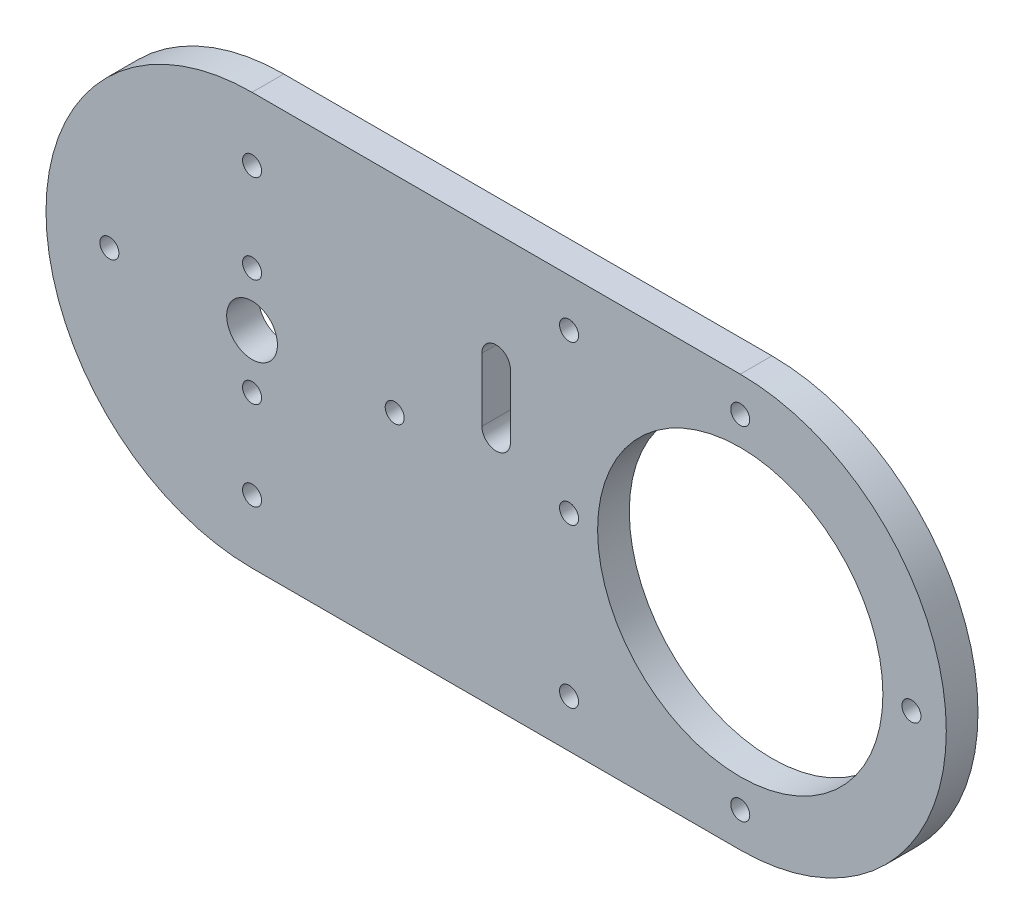
ISO-10303-21;
HEADER;
FILE_DESCRIPTION(('STEP AP214'),'2;1');
FILE_NAME('part.step','',(''),(''),'','','');
FILE_SCHEMA(('AUTOMOTIVE_DESIGN { 1 0 10303 214 1 1 1 1 }'));
ENDSEC;
DATA;
#1=APPLICATION_CONTEXT('core data for automotive mechanical design processes');
#2=APPLICATION_PROTOCOL_DEFINITION('international standard','automotive_design',2000,#1);
#3=PRODUCT_CONTEXT('',#1,'mechanical');
#4=PRODUCT('Part','Part','',(#3));
#5=PRODUCT_RELATED_PRODUCT_CATEGORY('part','',(#4));
#6=PRODUCT_DEFINITION_FORMATION('','',#4);
#7=PRODUCT_DEFINITION_CONTEXT('part definition',#1,'design');
#8=PRODUCT_DEFINITION('design','',#6,#7);
#9=PRODUCT_DEFINITION_SHAPE('','',#8);
#10=(LENGTH_UNIT() NAMED_UNIT(*) SI_UNIT(.MILLI.,.METRE.));
#11=(NAMED_UNIT(*) PLANE_ANGLE_UNIT() SI_UNIT($,.RADIAN.));
#12=(NAMED_UNIT(*) SI_UNIT($,.STERADIAN.) SOLID_ANGLE_UNIT());
#13=UNCERTAINTY_MEASURE_WITH_UNIT(LENGTH_MEASURE(1.E-05),#10,'distance_accuracy_value','');
#14=(GEOMETRIC_REPRESENTATION_CONTEXT(3) GLOBAL_UNCERTAINTY_ASSIGNED_CONTEXT((#13)) GLOBAL_UNIT_ASSIGNED_CONTEXT((#10,
#11,#12)) REPRESENTATION_CONTEXT('',''));
#15=CARTESIAN_POINT('',(0.,0.,0.));
#16=DIRECTION('',(0.,0.,1.));
#17=DIRECTION('',(1.,0.,0.));
#18=AXIS2_PLACEMENT_3D('',#15,#16,#17);
#19=CARTESIAN_POINT('',(-38.5,0.,5.));
#20=DIRECTION('',(0.,0.,1.));
#21=DIRECTION('',(1.,0.,0.));
#22=AXIS2_PLACEMENT_3D('',#19,#20,#21);
#23=PLANE('',#22);
#24=DIRECTION('',(0.,1.,0.));
#25=VECTOR('',#24,1.);
#26=CARTESIAN_POINT('',(2.25,5.,5.));
#27=LINE('',#26,#25);
#28=CARTESIAN_POINT('',(2.25,5.,5.));
#29=VERTEX_POINT('',#28);
#30=CARTESIAN_POINT('',(2.25,15.,5.));
#31=VERTEX_POINT('',#30);
#32=EDGE_CURVE('E105',#29,#31,#27,.T.);
#33=ORIENTED_EDGE('',*,*,#32,.F.);
#34=CARTESIAN_POINT('',(0.,5.,5.));
#35=DIRECTION('',(0.,0.,1.));
#36=DIRECTION('',(1.,0.,0.));
#37=AXIS2_PLACEMENT_3D('',#34,#35,#36);
#38=CIRCLE('',#37,2.25);
#39=CARTESIAN_POINT('',(-2.25,5.,5.));
#40=VERTEX_POINT('',#39);
#41=EDGE_CURVE('E97',#40,#29,#38,.T.);
#42=ORIENTED_EDGE('',*,*,#41,.F.);
#43=DIRECTION('',(0.,-1.,0.));
#44=VECTOR('',#43,1.);
#45=CARTESIAN_POINT('',(-2.25,5.,5.));
#46=LINE('',#45,#44);
#47=CARTESIAN_POINT('',(-2.25,15.,5.));
#48=VERTEX_POINT('',#47);
#49=EDGE_CURVE('E120',#48,#40,#46,.T.);
#50=ORIENTED_EDGE('',*,*,#49,.F.);
#51=CARTESIAN_POINT('',(0.,15.,5.));
#52=DIRECTION('',(0.,0.,1.));
#53=DIRECTION('',(1.,0.,0.));
#54=AXIS2_PLACEMENT_3D('',#51,#52,#53);
#55=CIRCLE('',#54,2.25);
#56=EDGE_CURVE('E118',#31,#48,#55,.T.);
#57=ORIENTED_EDGE('',*,*,#56,.F.);
#58=EDGE_LOOP('',(#33,#42,#50,#57));
#59=FACE_BOUND('',#58,.T.);
#60=CARTESIAN_POINT('',(11.5,25.,5.));
#61=DIRECTION('',(0.,0.,1.));
#62=DIRECTION('',(1.,0.,0.));
#63=AXIS2_PLACEMENT_3D('',#60,#61,#62);
#64=CIRCLE('',#63,1.5);
#65=CARTESIAN_POINT('',(13.,25.,5.));
#66=VERTEX_POINT('',#65);
#67=EDGE_CURVE('E136',#66,#66,#64,.T.);
#68=ORIENTED_EDGE('',*,*,#67,.F.);
#69=EDGE_LOOP('',(#68));
#70=FACE_BOUND('',#69,.T.);
#71=CARTESIAN_POINT('',(11.5,0.,5.));
#72=DIRECTION('',(0.,0.,1.));
#73=DIRECTION('',(1.,0.,0.));
#74=AXIS2_PLACEMENT_3D('',#71,#72,#73);
#75=CIRCLE('',#74,1.5);
#76=CARTESIAN_POINT('',(13.,0.,5.));
#77=VERTEX_POINT('',#76);
#78=EDGE_CURVE('E148',#77,#77,#75,.T.);
#79=ORIENTED_EDGE('',*,*,#78,.F.);
#80=EDGE_LOOP('',(#79));
#81=FACE_BOUND('',#80,.T.);
#82=CARTESIAN_POINT('',(-38.5,-22.5,5.));
#83=DIRECTION('',(0.,0.,1.));
#84=DIRECTION('',(1.,0.,0.));
#85=AXIS2_PLACEMENT_3D('',#82,#83,#84);
#86=CIRCLE('',#85,1.5);
#87=CARTESIAN_POINT('',(-37.,-22.5,5.));
#88=VERTEX_POINT('',#87);
#89=EDGE_CURVE('E160',#88,#88,#86,.T.);
#90=ORIENTED_EDGE('',*,*,#89,.F.);
#91=EDGE_LOOP('',(#90));
#92=FACE_BOUND('',#91,.T.);
#93=CARTESIAN_POINT('',(-38.5,22.5,5.));
#94=DIRECTION('',(0.,0.,1.));
#95=DIRECTION('',(1.,0.,0.));
#96=AXIS2_PLACEMENT_3D('',#93,#94,#95);
#97=CIRCLE('',#96,1.5);
#98=CARTESIAN_POINT('',(-37.,22.5,5.));
#99=VERTEX_POINT('',#98);
#100=EDGE_CURVE('E172',#99,#99,#97,.T.);
#101=ORIENTED_EDGE('',*,*,#100,.F.);
#102=EDGE_LOOP('',(#101));
#103=FACE_BOUND('',#102,.T.);
#104=CARTESIAN_POINT('',(-38.5,-8.5,5.));
#105=DIRECTION('',(0.,0.,1.));
#106=DIRECTION('',(1.,0.,0.));
#107=AXIS2_PLACEMENT_3D('',#104,#105,#106);
#108=CIRCLE('',#107,1.5);
#109=CARTESIAN_POINT('',(-37.,-8.5,5.));
#110=VERTEX_POINT('',#109);
#111=EDGE_CURVE('E184',#110,#110,#108,.T.);
#112=ORIENTED_EDGE('',*,*,#111,.F.);
#113=EDGE_LOOP('',(#112));
#114=FACE_BOUND('',#113,.T.);
#115=CARTESIAN_POINT('',(65.5,0.,5.));
#116=DIRECTION('',(0.,0.,1.));
#117=DIRECTION('',(1.,0.,0.));
#118=AXIS2_PLACEMENT_3D('',#115,#116,#117);
#119=CIRCLE('',#118,1.5);
#120=CARTESIAN_POINT('',(67.,0.,5.));
#121=VERTEX_POINT('',#120);
#122=EDGE_CURVE('E196',#121,#121,#119,.T.);
#123=ORIENTED_EDGE('',*,*,#122,.F.);
#124=EDGE_LOOP('',(#123));
#125=FACE_BOUND('',#124,.T.);
#126=CARTESIAN_POINT('',(-38.5,0.,5.));
#127=DIRECTION('',(0.,0.,1.));
#128=DIRECTION('',(1.,0.,0.));
#129=AXIS2_PLACEMENT_3D('',#126,#127,#128);
#130=CIRCLE('',#129,4.);
#131=CARTESIAN_POINT('',(-34.5,0.,5.));
#132=VERTEX_POINT('',#131);
#133=EDGE_CURVE('E208',#132,#132,#130,.T.);
#134=ORIENTED_EDGE('',*,*,#133,.F.);
#135=EDGE_LOOP('',(#134));
#136=FACE_BOUND('',#135,.T.);
#137=CARTESIAN_POINT('',(-38.5,0.,5.));
#138=DIRECTION('',(0.,0.,1.));
#139=DIRECTION('',(1.,0.,0.));
#140=AXIS2_PLACEMENT_3D('',#137,#138,#139);
#141=CIRCLE('',#140,32.5);
#142=CARTESIAN_POINT('',(-38.5,32.5,5.));
#143=VERTEX_POINT('',#142);
#144=CARTESIAN_POINT('',(-38.5,-32.5,5.));
#145=VERTEX_POINT('',#144);
#146=EDGE_CURVE('E214',#143,#145,#141,.T.);
#147=ORIENTED_EDGE('',*,*,#146,.T.);
#148=DIRECTION('',(1.,0.,0.));
#149=VECTOR('',#148,1.);
#150=CARTESIAN_POINT('',(-38.5,-32.5,5.));
#151=LINE('',#150,#149);
#152=CARTESIAN_POINT('',(38.5,-32.5,5.));
#153=VERTEX_POINT('',#152);
#154=EDGE_CURVE('E217',#145,#153,#151,.T.);
#155=ORIENTED_EDGE('',*,*,#154,.T.);
#156=CARTESIAN_POINT('',(38.5,0.,5.));
#157=DIRECTION('',(0.,0.,1.));
#158=DIRECTION('',(1.,0.,0.));
#159=AXIS2_PLACEMENT_3D('',#156,#157,#158);
#160=CIRCLE('',#159,32.5);
#161=CARTESIAN_POINT('',(38.5,32.5,5.));
#162=VERTEX_POINT('',#161);
#163=EDGE_CURVE('E220',#153,#162,#160,.T.);
#164=ORIENTED_EDGE('',*,*,#163,.T.);
#165=DIRECTION('',(-1.,0.,0.));
#166=VECTOR('',#165,1.);
#167=CARTESIAN_POINT('',(-38.5,32.5,5.));
#168=LINE('',#167,#166);
#169=EDGE_CURVE('E222',#162,#143,#168,.T.);
#170=ORIENTED_EDGE('',*,*,#169,.T.);
#171=EDGE_LOOP('',(#147,#155,#164,#170));
#172=FACE_BOUND('',#171,.T.);
#173=CARTESIAN_POINT('',(38.5,0.,5.));
#174=DIRECTION('',(0.,0.,1.));
#175=DIRECTION('',(1.,0.,0.));
#176=AXIS2_PLACEMENT_3D('',#173,#174,#175);
#177=CIRCLE('',#176,22.5);
#178=CARTESIAN_POINT('',(61.,0.,5.));
#179=VERTEX_POINT('',#178);
#180=EDGE_CURVE('E202',#179,#179,#177,.T.);
#181=ORIENTED_EDGE('',*,*,#180,.F.);
#182=EDGE_LOOP('',(#181));
#183=FACE_BOUND('',#182,.T.);
#184=CARTESIAN_POINT('',(-38.5,8.5,5.));
#185=DIRECTION('',(0.,0.,1.));
#186=DIRECTION('',(1.,0.,0.));
#187=AXIS2_PLACEMENT_3D('',#184,#185,#186);
#188=CIRCLE('',#187,1.5);
#189=CARTESIAN_POINT('',(-37.,8.5,5.));
#190=VERTEX_POINT('',#189);
#191=EDGE_CURVE('E190',#190,#190,#188,.T.);
#192=ORIENTED_EDGE('',*,*,#191,.F.);
#193=EDGE_LOOP('',(#192));
#194=FACE_BOUND('',#193,.T.);
#195=CARTESIAN_POINT('',(38.5,27.,5.));
#196=DIRECTION('',(0.,0.,1.));
#197=DIRECTION('',(1.,0.,0.));
#198=AXIS2_PLACEMENT_3D('',#195,#196,#197);
#199=CIRCLE('',#198,1.5);
#200=CARTESIAN_POINT('',(40.,27.,5.));
#201=VERTEX_POINT('',#200);
#202=EDGE_CURVE('E178',#201,#201,#199,.T.);
#203=ORIENTED_EDGE('',*,*,#202,.F.);
#204=EDGE_LOOP('',(#203));
#205=FACE_BOUND('',#204,.T.);
#206=CARTESIAN_POINT('',(-16.,0.,5.));
#207=DIRECTION('',(0.,0.,1.));
#208=DIRECTION('',(1.,0.,0.));
#209=AXIS2_PLACEMENT_3D('',#206,#207,#208);
#210=CIRCLE('',#209,1.5);
#211=CARTESIAN_POINT('',(-14.5,0.,5.));
#212=VERTEX_POINT('',#211);
#213=EDGE_CURVE('E166',#212,#212,#210,.T.);
#214=ORIENTED_EDGE('',*,*,#213,.F.);
#215=EDGE_LOOP('',(#214));
#216=FACE_BOUND('',#215,.T.);
#217=CARTESIAN_POINT('',(-61.,0.,5.));
#218=DIRECTION('',(0.,0.,1.));
#219=DIRECTION('',(1.,0.,0.));
#220=AXIS2_PLACEMENT_3D('',#217,#218,#219);
#221=CIRCLE('',#220,1.5);
#222=CARTESIAN_POINT('',(-59.5,0.,5.));
#223=VERTEX_POINT('',#222);
#224=EDGE_CURVE('E154',#223,#223,#221,.T.);
#225=ORIENTED_EDGE('',*,*,#224,.F.);
#226=EDGE_LOOP('',(#225));
#227=FACE_BOUND('',#226,.T.);
#228=CARTESIAN_POINT('',(11.5,-25.,5.));
#229=DIRECTION('',(0.,0.,1.));
#230=DIRECTION('',(1.,0.,0.));
#231=AXIS2_PLACEMENT_3D('',#228,#229,#230);
#232=CIRCLE('',#231,1.5);
#233=CARTESIAN_POINT('',(13.,-25.,5.));
#234=VERTEX_POINT('',#233);
#235=EDGE_CURVE('E142',#234,#234,#232,.T.);
#236=ORIENTED_EDGE('',*,*,#235,.F.);
#237=EDGE_LOOP('',(#236));
#238=FACE_BOUND('',#237,.T.);
#239=CARTESIAN_POINT('',(38.5,-27.,5.));
#240=DIRECTION('',(0.,0.,1.));
#241=DIRECTION('',(1.,0.,0.));
#242=AXIS2_PLACEMENT_3D('',#239,#240,#241);
#243=CIRCLE('',#242,1.5);
#244=CARTESIAN_POINT('',(40.,-27.,5.));
#245=VERTEX_POINT('',#244);
#246=EDGE_CURVE('E126',#245,#245,#243,.T.);
#247=ORIENTED_EDGE('',*,*,#246,.F.);
#248=EDGE_LOOP('',(#247));
#249=FACE_BOUND('',#248,.T.);
#250=ADVANCED_FACE('F32',(#59,#70,#81,#92,#103,#114,#125,#136,#172,#183,#194,#205,#216,#227,
#238,#249),#23,.T.);
#251=CARTESIAN_POINT('',(-38.5,0.,0.));
#252=DIRECTION('',(0.,0.,1.));
#253=DIRECTION('',(1.,0.,0.));
#254=AXIS2_PLACEMENT_3D('',#251,#252,#253);
#255=PLANE('',#254);
#256=CARTESIAN_POINT('',(11.5,25.,0.));
#257=DIRECTION('',(0.,0.,1.));
#258=DIRECTION('',(1.,0.,0.));
#259=AXIS2_PLACEMENT_3D('',#256,#257,#258);
#260=CIRCLE('',#259,1.5);
#261=CARTESIAN_POINT('',(13.,25.,0.));
#262=VERTEX_POINT('',#261);
#263=EDGE_CURVE('E113',#262,#262,#260,.T.);
#264=ORIENTED_EDGE('',*,*,#263,.T.);
#265=EDGE_LOOP('',(#264));
#266=FACE_BOUND('',#265,.T.);
#267=CARTESIAN_POINT('',(11.5,-25.,0.));
#268=DIRECTION('',(0.,0.,1.));
#269=DIRECTION('',(1.,0.,0.));
#270=AXIS2_PLACEMENT_3D('',#267,#268,#269);
#271=CIRCLE('',#270,1.5);
#272=CARTESIAN_POINT('',(13.,-25.,0.));
#273=VERTEX_POINT('',#272);
#274=EDGE_CURVE('E139',#273,#273,#271,.T.);
#275=ORIENTED_EDGE('',*,*,#274,.T.);
#276=EDGE_LOOP('',(#275));
#277=FACE_BOUND('',#276,.T.);
#278=CARTESIAN_POINT('',(11.5,0.,0.));
#279=DIRECTION('',(0.,0.,1.));
#280=DIRECTION('',(1.,0.,0.));
#281=AXIS2_PLACEMENT_3D('',#278,#279,#280);
#282=CIRCLE('',#281,1.5);
#283=CARTESIAN_POINT('',(13.,0.,0.));
#284=VERTEX_POINT('',#283);
#285=EDGE_CURVE('E145',#284,#284,#282,.T.);
#286=ORIENTED_EDGE('',*,*,#285,.T.);
#287=EDGE_LOOP('',(#286));
#288=FACE_BOUND('',#287,.T.);
#289=CARTESIAN_POINT('',(-61.,0.,0.));
#290=DIRECTION('',(0.,0.,1.));
#291=DIRECTION('',(1.,0.,0.));
#292=AXIS2_PLACEMENT_3D('',#289,#290,#291);
#293=CIRCLE('',#292,1.5);
#294=CARTESIAN_POINT('',(-59.5,0.,0.));
#295=VERTEX_POINT('',#294);
#296=EDGE_CURVE('E151',#295,#295,#293,.T.);
#297=ORIENTED_EDGE('',*,*,#296,.T.);
#298=EDGE_LOOP('',(#297));
#299=FACE_BOUND('',#298,.T.);
#300=CARTESIAN_POINT('',(-38.5,-22.5,0.));
#301=DIRECTION('',(0.,0.,1.));
#302=DIRECTION('',(1.,0.,0.));
#303=AXIS2_PLACEMENT_3D('',#300,#301,#302);
#304=CIRCLE('',#303,1.5);
#305=CARTESIAN_POINT('',(-37.,-22.5,0.));
#306=VERTEX_POINT('',#305);
#307=EDGE_CURVE('E157',#306,#306,#304,.T.);
#308=ORIENTED_EDGE('',*,*,#307,.T.);
#309=EDGE_LOOP('',(#308));
#310=FACE_BOUND('',#309,.T.);
#311=CARTESIAN_POINT('',(-16.,0.,0.));
#312=DIRECTION('',(0.,0.,1.));
#313=DIRECTION('',(1.,0.,0.));
#314=AXIS2_PLACEMENT_3D('',#311,#312,#313);
#315=CIRCLE('',#314,1.5);
#316=CARTESIAN_POINT('',(-14.5,0.,0.));
#317=VERTEX_POINT('',#316);
#318=EDGE_CURVE('E163',#317,#317,#315,.T.);
#319=ORIENTED_EDGE('',*,*,#318,.T.);
#320=EDGE_LOOP('',(#319));
#321=FACE_BOUND('',#320,.T.);
#322=CARTESIAN_POINT('',(-38.5,22.5,0.));
#323=DIRECTION('',(0.,0.,1.));
#324=DIRECTION('',(1.,0.,0.));
#325=AXIS2_PLACEMENT_3D('',#322,#323,#324);
#326=CIRCLE('',#325,1.5);
#327=CARTESIAN_POINT('',(-37.,22.5,0.));
#328=VERTEX_POINT('',#327);
#329=EDGE_CURVE('E169',#328,#328,#326,.T.);
#330=ORIENTED_EDGE('',*,*,#329,.T.);
#331=EDGE_LOOP('',(#330));
#332=FACE_BOUND('',#331,.T.);
#333=CARTESIAN_POINT('',(38.5,27.,0.));
#334=DIRECTION('',(0.,0.,1.));
#335=DIRECTION('',(1.,0.,0.));
#336=AXIS2_PLACEMENT_3D('',#333,#334,#335);
#337=CIRCLE('',#336,1.5);
#338=CARTESIAN_POINT('',(40.,27.,0.));
#339=VERTEX_POINT('',#338);
#340=EDGE_CURVE('E175',#339,#339,#337,.T.);
#341=ORIENTED_EDGE('',*,*,#340,.T.);
#342=EDGE_LOOP('',(#341));
#343=FACE_BOUND('',#342,.T.);
#344=CARTESIAN_POINT('',(-38.5,-8.5,0.));
#345=DIRECTION('',(0.,0.,1.));
#346=DIRECTION('',(1.,0.,0.));
#347=AXIS2_PLACEMENT_3D('',#344,#345,#346);
#348=CIRCLE('',#347,1.5);
#349=CARTESIAN_POINT('',(-37.,-8.5,0.));
#350=VERTEX_POINT('',#349);
#351=EDGE_CURVE('E181',#350,#350,#348,.T.);
#352=ORIENTED_EDGE('',*,*,#351,.T.);
#353=EDGE_LOOP('',(#352));
#354=FACE_BOUND('',#353,.T.);
#355=CARTESIAN_POINT('',(-38.5,8.5,0.));
#356=DIRECTION('',(0.,0.,1.));
#357=DIRECTION('',(1.,0.,0.));
#358=AXIS2_PLACEMENT_3D('',#355,#356,#357);
#359=CIRCLE('',#358,1.5);
#360=CARTESIAN_POINT('',(-37.,8.5,0.));
#361=VERTEX_POINT('',#360);
#362=EDGE_CURVE('E187',#361,#361,#359,.T.);
#363=ORIENTED_EDGE('',*,*,#362,.T.);
#364=EDGE_LOOP('',(#363));
#365=FACE_BOUND('',#364,.T.);
#366=CARTESIAN_POINT('',(65.5,0.,0.));
#367=DIRECTION('',(0.,0.,1.));
#368=DIRECTION('',(1.,0.,0.));
#369=AXIS2_PLACEMENT_3D('',#366,#367,#368);
#370=CIRCLE('',#369,1.5);
#371=CARTESIAN_POINT('',(67.,0.,0.));
#372=VERTEX_POINT('',#371);
#373=EDGE_CURVE('E193',#372,#372,#370,.T.);
#374=ORIENTED_EDGE('',*,*,#373,.T.);
#375=EDGE_LOOP('',(#374));
#376=FACE_BOUND('',#375,.T.);
#377=CARTESIAN_POINT('',(38.5,0.,0.));
#378=DIRECTION('',(0.,0.,1.));
#379=DIRECTION('',(1.,0.,0.));
#380=AXIS2_PLACEMENT_3D('',#377,#378,#379);
#381=CIRCLE('',#380,22.5);
#382=CARTESIAN_POINT('',(61.,0.,0.));
#383=VERTEX_POINT('',#382);
#384=EDGE_CURVE('E199',#383,#383,#381,.T.);
#385=ORIENTED_EDGE('',*,*,#384,.T.);
#386=EDGE_LOOP('',(#385));
#387=FACE_BOUND('',#386,.T.);
#388=CARTESIAN_POINT('',(-38.5,0.,0.));
#389=DIRECTION('',(0.,0.,1.));
#390=DIRECTION('',(1.,0.,0.));
#391=AXIS2_PLACEMENT_3D('',#388,#389,#390);
#392=CIRCLE('',#391,4.);
#393=CARTESIAN_POINT('',(-34.5,0.,0.));
#394=VERTEX_POINT('',#393);
#395=EDGE_CURVE('E205',#394,#394,#392,.T.);
#396=ORIENTED_EDGE('',*,*,#395,.T.);
#397=EDGE_LOOP('',(#396));
#398=FACE_BOUND('',#397,.T.);
#399=CARTESIAN_POINT('',(-38.5,0.,0.));
#400=DIRECTION('',(0.,0.,1.));
#401=DIRECTION('',(1.,0.,0.));
#402=AXIS2_PLACEMENT_3D('',#399,#400,#401);
#403=CIRCLE('',#402,32.5);
#404=CARTESIAN_POINT('',(-38.5,32.5,0.));
#405=VERTEX_POINT('',#404);
#406=CARTESIAN_POINT('',(-38.5,-32.5,0.));
#407=VERTEX_POINT('',#406);
#408=EDGE_CURVE('E211',#405,#407,#403,.T.);
#409=ORIENTED_EDGE('',*,*,#408,.F.);
#410=DIRECTION('',(-1.,0.,0.));
#411=VECTOR('',#410,1.);
#412=CARTESIAN_POINT('',(-38.5,32.5,0.));
#413=LINE('',#412,#411);
#414=CARTESIAN_POINT('',(38.5,32.5,0.));
#415=VERTEX_POINT('',#414);
#416=EDGE_CURVE('E218',#415,#405,#413,.T.);
#417=ORIENTED_EDGE('',*,*,#416,.F.);
#418=CARTESIAN_POINT('',(38.5,0.,0.));
#419=DIRECTION('',(0.,0.,1.));
#420=DIRECTION('',(1.,0.,0.));
#421=AXIS2_PLACEMENT_3D('',#418,#419,#420);
#422=CIRCLE('',#421,32.5);
#423=CARTESIAN_POINT('',(38.5,-32.5,0.));
#424=VERTEX_POINT('',#423);
#425=EDGE_CURVE('E229',#424,#415,#422,.T.);
#426=ORIENTED_EDGE('',*,*,#425,.F.);
#427=DIRECTION('',(1.,0.,0.));
#428=VECTOR('',#427,1.);
#429=CARTESIAN_POINT('',(-38.5,-32.5,0.));
#430=LINE('',#429,#428);
#431=EDGE_CURVE('E227',#407,#424,#430,.T.);
#432=ORIENTED_EDGE('',*,*,#431,.F.);
#433=EDGE_LOOP('',(#409,#417,#426,#432));
#434=FACE_BOUND('',#433,.T.);
#435=CARTESIAN_POINT('',(0.,5.,0.));
#436=DIRECTION('',(0.,0.,1.));
#437=DIRECTION('',(1.,0.,0.));
#438=AXIS2_PLACEMENT_3D('',#435,#436,#437);
#439=CIRCLE('',#438,2.25);
#440=CARTESIAN_POINT('',(-2.25,5.,0.));
#441=VERTEX_POINT('',#440);
#442=CARTESIAN_POINT('',(2.25,5.,0.));
#443=VERTEX_POINT('',#442);
#444=EDGE_CURVE('E55',#441,#443,#439,.T.);
#445=ORIENTED_EDGE('',*,*,#444,.T.);
#446=DIRECTION('',(0.,1.,0.));
#447=VECTOR('',#446,1.);
#448=CARTESIAN_POINT('',(2.25,5.,0.));
#449=LINE('',#448,#447);
#450=CARTESIAN_POINT('',(2.25,15.,0.));
#451=VERTEX_POINT('',#450);
#452=EDGE_CURVE('E112',#443,#451,#449,.T.);
#453=ORIENTED_EDGE('',*,*,#452,.T.);
#454=CARTESIAN_POINT('',(0.,15.,0.));
#455=DIRECTION('',(0.,0.,1.));
#456=DIRECTION('',(1.,0.,0.));
#457=AXIS2_PLACEMENT_3D('',#454,#455,#456);
#458=CIRCLE('',#457,2.25);
#459=CARTESIAN_POINT('',(-2.25,15.,0.));
#460=VERTEX_POINT('',#459);
#461=EDGE_CURVE('E128',#451,#460,#458,.T.);
#462=ORIENTED_EDGE('',*,*,#461,.T.);
#463=DIRECTION('',(0.,-1.,0.));
#464=VECTOR('',#463,1.);
#465=CARTESIAN_POINT('',(-2.25,5.,0.));
#466=LINE('',#465,#464);
#467=EDGE_CURVE('E106',#460,#441,#466,.T.);
#468=ORIENTED_EDGE('',*,*,#467,.T.);
#469=EDGE_LOOP('',(#445,#453,#462,#468));
#470=FACE_BOUND('',#469,.T.);
#471=CARTESIAN_POINT('',(38.5,-27.,0.));
#472=DIRECTION('',(0.,0.,1.));
#473=DIRECTION('',(1.,0.,0.));
#474=AXIS2_PLACEMENT_3D('',#471,#472,#473);
#475=CIRCLE('',#474,1.5);
#476=CARTESIAN_POINT('',(40.,-27.,0.));
#477=VERTEX_POINT('',#476);
#478=EDGE_CURVE('E360',#477,#477,#475,.T.);
#479=ORIENTED_EDGE('',*,*,#478,.T.);
#480=EDGE_LOOP('',(#479));
#481=FACE_BOUND('',#480,.T.);
#482=ADVANCED_FACE('F247',(#266,#277,#288,#299,#310,#321,#332,#343,#354,#365,#376,#387,#398,
#434,#470,#481),#255,.F.);
#483=CARTESIAN_POINT('',(-38.5,0.,5.));
#484=DIRECTION('',(0.,0.,-1.));
#485=DIRECTION('',(-1.,0.,0.));
#486=AXIS2_PLACEMENT_3D('',#483,#484,#485);
#487=CYLINDRICAL_SURFACE('',#486,32.5);
#488=ORIENTED_EDGE('',*,*,#408,.T.);
#489=DIRECTION('',(0.,0.,-1.));
#490=VECTOR('',#489,1.);
#491=CARTESIAN_POINT('',(-38.5,-32.5,5.));
#492=LINE('',#491,#490);
#493=EDGE_CURVE('E11',#145,#407,#492,.T.);
#494=ORIENTED_EDGE('',*,*,#493,.F.);
#495=ORIENTED_EDGE('',*,*,#146,.F.);
#496=DIRECTION('',(0.,0.,-1.));
#497=VECTOR('',#496,1.);
#498=CARTESIAN_POINT('',(-38.5,32.5,5.));
#499=LINE('',#498,#497);
#500=EDGE_CURVE('E224',#143,#405,#499,.T.);
#501=ORIENTED_EDGE('',*,*,#500,.T.);
#502=EDGE_LOOP('',(#488,#494,#495,#501));
#503=FACE_BOUND('',#502,.T.);
#504=ADVANCED_FACE('F34',(#503),#487,.T.);
#505=CARTESIAN_POINT('',(-38.5,-32.5,5.));
#506=DIRECTION('',(0.,1.,0.));
#507=DIRECTION('',(0.,0.,1.));
#508=AXIS2_PLACEMENT_3D('',#505,#506,#507);
#509=PLANE('',#508);
#510=ORIENTED_EDGE('',*,*,#431,.T.);
#511=DIRECTION('',(0.,0.,-1.));
#512=VECTOR('',#511,1.);
#513=CARTESIAN_POINT('',(38.5,-32.5,5.));
#514=LINE('',#513,#512);
#515=EDGE_CURVE('E40',#153,#424,#514,.T.);
#516=ORIENTED_EDGE('',*,*,#515,.F.);
#517=ORIENTED_EDGE('',*,*,#154,.F.);
#518=ORIENTED_EDGE('',*,*,#493,.T.);
#519=EDGE_LOOP('',(#510,#516,#517,#518));
#520=FACE_BOUND('',#519,.T.);
#521=ADVANCED_FACE('F258',(#520),#509,.F.);
#522=CARTESIAN_POINT('',(38.5,0.,5.));
#523=DIRECTION('',(0.,0.,-1.));
#524=DIRECTION('',(-1.,0.,0.));
#525=AXIS2_PLACEMENT_3D('',#522,#523,#524);
#526=CYLINDRICAL_SURFACE('',#525,32.5);
#527=ORIENTED_EDGE('',*,*,#425,.T.);
#528=DIRECTION('',(0.,0.,-1.));
#529=VECTOR('',#528,1.);
#530=CARTESIAN_POINT('',(38.5,32.5,5.));
#531=LINE('',#530,#529);
#532=EDGE_CURVE('E234',#162,#415,#531,.T.);
#533=ORIENTED_EDGE('',*,*,#532,.F.);
#534=ORIENTED_EDGE('',*,*,#163,.F.);
#535=ORIENTED_EDGE('',*,*,#515,.T.);
#536=EDGE_LOOP('',(#527,#533,#534,#535));
#537=FACE_BOUND('',#536,.T.);
#538=ADVANCED_FACE('F241',(#537),#526,.T.);
#539=CARTESIAN_POINT('',(-38.5,32.5,5.));
#540=DIRECTION('',(0.,-1.,0.));
#541=DIRECTION('',(0.,0.,-1.));
#542=AXIS2_PLACEMENT_3D('',#539,#540,#541);
#543=PLANE('',#542);
#544=ORIENTED_EDGE('',*,*,#416,.T.);
#545=ORIENTED_EDGE('',*,*,#500,.F.);
#546=ORIENTED_EDGE('',*,*,#169,.F.);
#547=ORIENTED_EDGE('',*,*,#532,.T.);
#548=EDGE_LOOP('',(#544,#545,#546,#547));
#549=FACE_BOUND('',#548,.T.);
#550=ADVANCED_FACE('F251',(#549),#543,.F.);
#551=CARTESIAN_POINT('',(-38.5,0.,5.));
#552=DIRECTION('',(0.,0.,-1.));
#553=DIRECTION('',(-1.,0.,0.));
#554=AXIS2_PLACEMENT_3D('',#551,#552,#553);
#555=CYLINDRICAL_SURFACE('',#554,4.);
#556=ORIENTED_EDGE('',*,*,#133,.T.);
#557=EDGE_LOOP('',(#556));
#558=FACE_BOUND('',#557,.T.);
#559=ORIENTED_EDGE('',*,*,#395,.F.);
#560=EDGE_LOOP('',(#559));
#561=FACE_BOUND('',#560,.T.);
#562=ADVANCED_FACE('F273',(#558,#561),#555,.F.);
#563=CARTESIAN_POINT('',(38.5,0.,5.));
#564=DIRECTION('',(0.,0.,-1.));
#565=DIRECTION('',(-1.,0.,0.));
#566=AXIS2_PLACEMENT_3D('',#563,#564,#565);
#567=CYLINDRICAL_SURFACE('',#566,22.5);
#568=ORIENTED_EDGE('',*,*,#180,.T.);
#569=EDGE_LOOP('',(#568));
#570=FACE_BOUND('',#569,.T.);
#571=ORIENTED_EDGE('',*,*,#384,.F.);
#572=EDGE_LOOP('',(#571));
#573=FACE_BOUND('',#572,.T.);
#574=ADVANCED_FACE('F280',(#570,#573),#567,.F.);
#575=CARTESIAN_POINT('',(65.5,0.,5.));
#576=DIRECTION('',(0.,0.,-1.));
#577=DIRECTION('',(-1.,0.,0.));
#578=AXIS2_PLACEMENT_3D('',#575,#576,#577);
#579=CYLINDRICAL_SURFACE('',#578,1.5);
#580=ORIENTED_EDGE('',*,*,#122,.T.);
#581=EDGE_LOOP('',(#580));
#582=FACE_BOUND('',#581,.T.);
#583=ORIENTED_EDGE('',*,*,#373,.F.);
#584=EDGE_LOOP('',(#583));
#585=FACE_BOUND('',#584,.T.);
#586=ADVANCED_FACE('F285',(#582,#585),#579,.F.);
#587=CARTESIAN_POINT('',(-38.5,8.5,5.));
#588=DIRECTION('',(0.,0.,-1.));
#589=DIRECTION('',(-1.,0.,0.));
#590=AXIS2_PLACEMENT_3D('',#587,#588,#589);
#591=CYLINDRICAL_SURFACE('',#590,1.5);
#592=ORIENTED_EDGE('',*,*,#191,.T.);
#593=EDGE_LOOP('',(#592));
#594=FACE_BOUND('',#593,.T.);
#595=ORIENTED_EDGE('',*,*,#362,.F.);
#596=EDGE_LOOP('',(#595));
#597=FACE_BOUND('',#596,.T.);
#598=ADVANCED_FACE('F295',(#594,#597),#591,.F.);
#599=CARTESIAN_POINT('',(-38.5,-8.5,5.));
#600=DIRECTION('',(0.,0.,-1.));
#601=DIRECTION('',(-1.,0.,0.));
#602=AXIS2_PLACEMENT_3D('',#599,#600,#601);
#603=CYLINDRICAL_SURFACE('',#602,1.5);
#604=ORIENTED_EDGE('',*,*,#111,.T.);
#605=EDGE_LOOP('',(#604));
#606=FACE_BOUND('',#605,.T.);
#607=ORIENTED_EDGE('',*,*,#351,.F.);
#608=EDGE_LOOP('',(#607));
#609=FACE_BOUND('',#608,.T.);
#610=ADVANCED_FACE('F302',(#606,#609),#603,.F.);
#611=CARTESIAN_POINT('',(38.5,27.,5.));
#612=DIRECTION('',(0.,0.,-1.));
#613=DIRECTION('',(-1.,0.,0.));
#614=AXIS2_PLACEMENT_3D('',#611,#612,#613);
#615=CYLINDRICAL_SURFACE('',#614,1.5);
#616=ORIENTED_EDGE('',*,*,#202,.T.);
#617=EDGE_LOOP('',(#616));
#618=FACE_BOUND('',#617,.T.);
#619=ORIENTED_EDGE('',*,*,#340,.F.);
#620=EDGE_LOOP('',(#619));
#621=FACE_BOUND('',#620,.T.);
#622=ADVANCED_FACE('F306',(#618,#621),#615,.F.);
#623=CARTESIAN_POINT('',(-38.5,22.5,5.));
#624=DIRECTION('',(0.,0.,-1.));
#625=DIRECTION('',(-1.,0.,0.));
#626=AXIS2_PLACEMENT_3D('',#623,#624,#625);
#627=CYLINDRICAL_SURFACE('',#626,1.5);
#628=ORIENTED_EDGE('',*,*,#100,.T.);
#629=EDGE_LOOP('',(#628));
#630=FACE_BOUND('',#629,.T.);
#631=ORIENTED_EDGE('',*,*,#329,.F.);
#632=EDGE_LOOP('',(#631));
#633=FACE_BOUND('',#632,.T.);
#634=ADVANCED_FACE('F310',(#630,#633),#627,.F.);
#635=CARTESIAN_POINT('',(-16.,0.,5.));
#636=DIRECTION('',(0.,0.,-1.));
#637=DIRECTION('',(-1.,0.,0.));
#638=AXIS2_PLACEMENT_3D('',#635,#636,#637);
#639=CYLINDRICAL_SURFACE('',#638,1.5);
#640=ORIENTED_EDGE('',*,*,#213,.T.);
#641=EDGE_LOOP('',(#640));
#642=FACE_BOUND('',#641,.T.);
#643=ORIENTED_EDGE('',*,*,#318,.F.);
#644=EDGE_LOOP('',(#643));
#645=FACE_BOUND('',#644,.T.);
#646=ADVANCED_FACE('F314',(#642,#645),#639,.F.);
#647=CARTESIAN_POINT('',(-38.5,-22.5,5.));
#648=DIRECTION('',(0.,0.,-1.));
#649=DIRECTION('',(-1.,0.,0.));
#650=AXIS2_PLACEMENT_3D('',#647,#648,#649);
#651=CYLINDRICAL_SURFACE('',#650,1.5);
#652=ORIENTED_EDGE('',*,*,#89,.T.);
#653=EDGE_LOOP('',(#652));
#654=FACE_BOUND('',#653,.T.);
#655=ORIENTED_EDGE('',*,*,#307,.F.);
#656=EDGE_LOOP('',(#655));
#657=FACE_BOUND('',#656,.T.);
#658=ADVANCED_FACE('F318',(#654,#657),#651,.F.);
#659=CARTESIAN_POINT('',(-61.,0.,5.));
#660=DIRECTION('',(0.,0.,-1.));
#661=DIRECTION('',(-1.,0.,0.));
#662=AXIS2_PLACEMENT_3D('',#659,#660,#661);
#663=CYLINDRICAL_SURFACE('',#662,1.5);
#664=ORIENTED_EDGE('',*,*,#224,.T.);
#665=EDGE_LOOP('',(#664));
#666=FACE_BOUND('',#665,.T.);
#667=ORIENTED_EDGE('',*,*,#296,.F.);
#668=EDGE_LOOP('',(#667));
#669=FACE_BOUND('',#668,.T.);
#670=ADVANCED_FACE('F322',(#666,#669),#663,.F.);
#671=CARTESIAN_POINT('',(11.5,0.,5.));
#672=DIRECTION('',(0.,0.,-1.));
#673=DIRECTION('',(-1.,0.,0.));
#674=AXIS2_PLACEMENT_3D('',#671,#672,#673);
#675=CYLINDRICAL_SURFACE('',#674,1.5);
#676=ORIENTED_EDGE('',*,*,#78,.T.);
#677=EDGE_LOOP('',(#676));
#678=FACE_BOUND('',#677,.T.);
#679=ORIENTED_EDGE('',*,*,#285,.F.);
#680=EDGE_LOOP('',(#679));
#681=FACE_BOUND('',#680,.T.);
#682=ADVANCED_FACE('F326',(#678,#681),#675,.F.);
#683=CARTESIAN_POINT('',(11.5,-25.,5.));
#684=DIRECTION('',(0.,0.,-1.));
#685=DIRECTION('',(-1.,0.,0.));
#686=AXIS2_PLACEMENT_3D('',#683,#684,#685);
#687=CYLINDRICAL_SURFACE('',#686,1.5);
#688=ORIENTED_EDGE('',*,*,#235,.T.);
#689=EDGE_LOOP('',(#688));
#690=FACE_BOUND('',#689,.T.);
#691=ORIENTED_EDGE('',*,*,#274,.F.);
#692=EDGE_LOOP('',(#691));
#693=FACE_BOUND('',#692,.T.);
#694=ADVANCED_FACE('F330',(#690,#693),#687,.F.);
#695=CARTESIAN_POINT('',(11.5,25.,5.));
#696=DIRECTION('',(0.,0.,-1.));
#697=DIRECTION('',(-1.,0.,0.));
#698=AXIS2_PLACEMENT_3D('',#695,#696,#697);
#699=CYLINDRICAL_SURFACE('',#698,1.5);
#700=ORIENTED_EDGE('',*,*,#67,.T.);
#701=EDGE_LOOP('',(#700));
#702=FACE_BOUND('',#701,.T.);
#703=ORIENTED_EDGE('',*,*,#263,.F.);
#704=EDGE_LOOP('',(#703));
#705=FACE_BOUND('',#704,.T.);
#706=ADVANCED_FACE('F334',(#702,#705),#699,.F.);
#707=CARTESIAN_POINT('',(0.,5.,5.));
#708=DIRECTION('',(0.,0.,-1.));
#709=DIRECTION('',(-1.,0.,0.));
#710=AXIS2_PLACEMENT_3D('',#707,#708,#709);
#711=CYLINDRICAL_SURFACE('',#710,2.25);
#712=ORIENTED_EDGE('',*,*,#444,.F.);
#713=DIRECTION('',(0.,0.,-1.));
#714=VECTOR('',#713,1.);
#715=CARTESIAN_POINT('',(-2.25,5.,5.));
#716=LINE('',#715,#714);
#717=EDGE_CURVE('E101',#40,#441,#716,.T.);
#718=ORIENTED_EDGE('',*,*,#717,.F.);
#719=ORIENTED_EDGE('',*,*,#41,.T.);
#720=DIRECTION('',(0.,0.,-1.));
#721=VECTOR('',#720,1.);
#722=CARTESIAN_POINT('',(2.25,5.,5.));
#723=LINE('',#722,#721);
#724=EDGE_CURVE('E100',#29,#443,#723,.T.);
#725=ORIENTED_EDGE('',*,*,#724,.T.);
#726=EDGE_LOOP('',(#712,#718,#719,#725));
#727=FACE_BOUND('',#726,.T.);
#728=ADVANCED_FACE('F99',(#727),#711,.F.);
#729=CARTESIAN_POINT('',(2.25,5.,5.));
#730=DIRECTION('',(-1.,0.,0.));
#731=DIRECTION('',(0.,0.,1.));
#732=AXIS2_PLACEMENT_3D('',#729,#730,#731);
#733=PLANE('',#732);
#734=ORIENTED_EDGE('',*,*,#452,.F.);
#735=ORIENTED_EDGE('',*,*,#724,.F.);
#736=ORIENTED_EDGE('',*,*,#32,.T.);
#737=DIRECTION('',(0.,0.,-1.));
#738=VECTOR('',#737,1.);
#739=CARTESIAN_POINT('',(2.25,15.,5.));
#740=LINE('',#739,#738);
#741=EDGE_CURVE('E114',#31,#451,#740,.T.);
#742=ORIENTED_EDGE('',*,*,#741,.T.);
#743=EDGE_LOOP('',(#734,#735,#736,#742));
#744=FACE_BOUND('',#743,.T.);
#745=ADVANCED_FACE('F109',(#744),#733,.T.);
#746=CARTESIAN_POINT('',(0.,15.,5.));
#747=DIRECTION('',(0.,0.,-1.));
#748=DIRECTION('',(-1.,0.,0.));
#749=AXIS2_PLACEMENT_3D('',#746,#747,#748);
#750=CYLINDRICAL_SURFACE('',#749,2.25);
#751=ORIENTED_EDGE('',*,*,#461,.F.);
#752=ORIENTED_EDGE('',*,*,#741,.F.);
#753=ORIENTED_EDGE('',*,*,#56,.T.);
#754=DIRECTION('',(0.,0.,-1.));
#755=VECTOR('',#754,1.);
#756=CARTESIAN_POINT('',(-2.25,15.,5.));
#757=LINE('',#756,#755);
#758=EDGE_CURVE('E47',#48,#460,#757,.T.);
#759=ORIENTED_EDGE('',*,*,#758,.T.);
#760=EDGE_LOOP('',(#751,#752,#753,#759));
#761=FACE_BOUND('',#760,.T.);
#762=ADVANCED_FACE('F343',(#761),#750,.F.);
#763=CARTESIAN_POINT('',(-2.25,5.,5.));
#764=DIRECTION('',(1.,0.,0.));
#765=DIRECTION('',(0.,0.,-1.));
#766=AXIS2_PLACEMENT_3D('',#763,#764,#765);
#767=PLANE('',#766);
#768=ORIENTED_EDGE('',*,*,#467,.F.);
#769=ORIENTED_EDGE('',*,*,#758,.F.);
#770=ORIENTED_EDGE('',*,*,#49,.T.);
#771=ORIENTED_EDGE('',*,*,#717,.T.);
#772=EDGE_LOOP('',(#768,#769,#770,#771));
#773=FACE_BOUND('',#772,.T.);
#774=ADVANCED_FACE('F346',(#773),#767,.T.);
#775=CARTESIAN_POINT('',(38.5,-27.,5.));
#776=DIRECTION('',(0.,0.,-1.));
#777=DIRECTION('',(-1.,0.,0.));
#778=AXIS2_PLACEMENT_3D('',#775,#776,#777);
#779=CYLINDRICAL_SURFACE('',#778,1.5);
#780=ORIENTED_EDGE('',*,*,#246,.T.);
#781=EDGE_LOOP('',(#780));
#782=FACE_BOUND('',#781,.T.);
#783=ORIENTED_EDGE('',*,*,#478,.F.);
#784=EDGE_LOOP('',(#783));
#785=FACE_BOUND('',#784,.T.);
#786=ADVANCED_FACE('F350',(#782,#785),#779,.F.);
#787=CLOSED_SHELL('',(#250,#482,#504,#521,#538,#550,#562,#574,#586,#598,#610,#622,#634,#646,
#658,#670,#682,#694,#706,#728,#745,#762,#774,#786));
#788=MANIFOLD_SOLID_BREP('B2',#787);
#789=ADVANCED_BREP_SHAPE_REPRESENTATION('',(#18,#788),#14);
#790=SHAPE_DEFINITION_REPRESENTATION(#9,#789);
ENDSEC;
END-ISO-10303-21;
